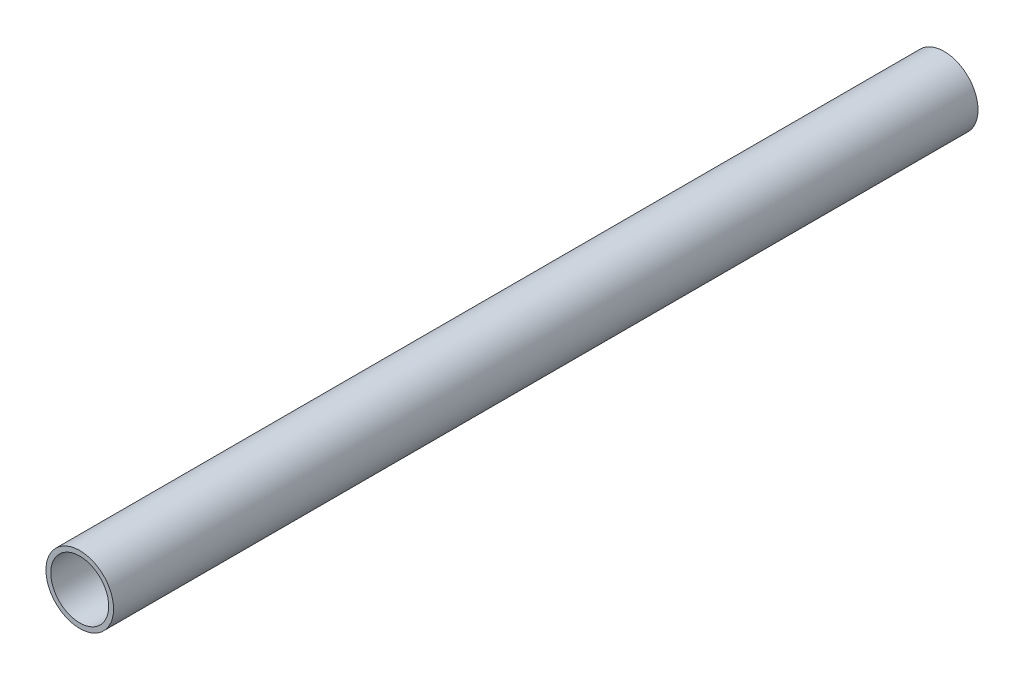
ISO-10303-21;
HEADER;
FILE_DESCRIPTION(('STEP AP214'),'2;1');
FILE_NAME('part.step','',(''),(''),'','','');
FILE_SCHEMA(('AUTOMOTIVE_DESIGN { 1 0 10303 214 1 1 1 1 }'));
ENDSEC;
DATA;
#1=APPLICATION_CONTEXT('core data for automotive mechanical design processes');
#2=APPLICATION_PROTOCOL_DEFINITION('international standard','automotive_design',2000,#1);
#3=PRODUCT_CONTEXT('',#1,'mechanical');
#4=PRODUCT('Part','Part','',(#3));
#5=PRODUCT_RELATED_PRODUCT_CATEGORY('part','',(#4));
#6=PRODUCT_DEFINITION_FORMATION('','',#4);
#7=PRODUCT_DEFINITION_CONTEXT('part definition',#1,'design');
#8=PRODUCT_DEFINITION('design','',#6,#7);
#9=PRODUCT_DEFINITION_SHAPE('','',#8);
#10=(LENGTH_UNIT() NAMED_UNIT(*) SI_UNIT(.MILLI.,.METRE.));
#11=(NAMED_UNIT(*) PLANE_ANGLE_UNIT() SI_UNIT($,.RADIAN.));
#12=(NAMED_UNIT(*) SI_UNIT($,.STERADIAN.) SOLID_ANGLE_UNIT());
#13=UNCERTAINTY_MEASURE_WITH_UNIT(LENGTH_MEASURE(1.E-05),#10,'distance_accuracy_value','');
#14=(GEOMETRIC_REPRESENTATION_CONTEXT(3) GLOBAL_UNCERTAINTY_ASSIGNED_CONTEXT((#13)) GLOBAL_UNIT_ASSIGNED_CONTEXT((#10,
#11,#12)) REPRESENTATION_CONTEXT('',''));
#15=CARTESIAN_POINT('',(0.,0.,0.));
#16=DIRECTION('',(0.,0.,1.));
#17=DIRECTION('',(1.,0.,0.));
#18=AXIS2_PLACEMENT_3D('',#15,#16,#17);
#19=CARTESIAN_POINT('',(0.,0.,142.113));
#20=DIRECTION('',(0.,0.,1.));
#21=DIRECTION('',(1.,0.,0.));
#22=AXIS2_PLACEMENT_3D('',#19,#20,#21);
#23=PLANE('',#22);
#24=CARTESIAN_POINT('',(0.,0.,142.113));
#25=DIRECTION('',(0.,0.,1.));
#26=DIRECTION('',(1.,0.,0.));
#27=AXIS2_PLACEMENT_3D('',#24,#25,#26);
#28=CIRCLE('',#27,11.1125);
#29=CARTESIAN_POINT('',(11.1125,0.,142.113));
#30=VERTEX_POINT('',#29);
#31=EDGE_CURVE('E10',#30,#30,#28,.T.);
#32=ORIENTED_EDGE('',*,*,#31,.T.);
#33=EDGE_LOOP('',(#32));
#34=FACE_BOUND('',#33,.T.);
#35=CARTESIAN_POINT('',(0.,0.,142.113));
#36=DIRECTION('',(0.,0.,1.));
#37=DIRECTION('',(1.,0.,0.));
#38=AXIS2_PLACEMENT_3D('',#35,#36,#37);
#39=CIRCLE('',#38,9.525);
#40=CARTESIAN_POINT('',(9.525,0.,142.113));
#41=VERTEX_POINT('',#40);
#42=EDGE_CURVE('E45',#41,#41,#39,.T.);
#43=ORIENTED_EDGE('',*,*,#42,.F.);
#44=EDGE_LOOP('',(#43));
#45=FACE_BOUND('',#44,.T.);
#46=ADVANCED_FACE('F34',(#34,#45),#23,.T.);
#47=CARTESIAN_POINT('',(0.,0.,-142.113));
#48=DIRECTION('',(0.,0.,1.));
#49=DIRECTION('',(1.,0.,0.));
#50=AXIS2_PLACEMENT_3D('',#47,#48,#49);
#51=PLANE('',#50);
#52=CARTESIAN_POINT('',(0.,0.,-142.113));
#53=DIRECTION('',(0.,0.,1.));
#54=DIRECTION('',(1.,0.,0.));
#55=AXIS2_PLACEMENT_3D('',#52,#53,#54);
#56=CIRCLE('',#55,11.1125);
#57=CARTESIAN_POINT('',(11.1125,0.,-142.113));
#58=VERTEX_POINT('',#57);
#59=EDGE_CURVE('E38',#58,#58,#56,.T.);
#60=ORIENTED_EDGE('',*,*,#59,.F.);
#61=EDGE_LOOP('',(#60));
#62=FACE_BOUND('',#61,.T.);
#63=CARTESIAN_POINT('',(0.,0.,-142.113));
#64=DIRECTION('',(0.,0.,1.));
#65=DIRECTION('',(1.,0.,0.));
#66=AXIS2_PLACEMENT_3D('',#63,#64,#65);
#67=CIRCLE('',#66,9.525);
#68=CARTESIAN_POINT('',(9.525,0.,-142.113));
#69=VERTEX_POINT('',#68);
#70=EDGE_CURVE('E47',#69,#69,#67,.T.);
#71=ORIENTED_EDGE('',*,*,#70,.T.);
#72=EDGE_LOOP('',(#71));
#73=FACE_BOUND('',#72,.T.);
#74=ADVANCED_FACE('F57',(#62,#73),#51,.F.);
#75=CARTESIAN_POINT('',(0.,0.,142.113));
#76=DIRECTION('',(0.,0.,-1.));
#77=DIRECTION('',(-1.,0.,0.));
#78=AXIS2_PLACEMENT_3D('',#75,#76,#77);
#79=CYLINDRICAL_SURFACE('',#78,11.1125);
#80=ORIENTED_EDGE('',*,*,#31,.F.);
#81=EDGE_LOOP('',(#80));
#82=FACE_BOUND('',#81,.T.);
#83=ORIENTED_EDGE('',*,*,#59,.T.);
#84=EDGE_LOOP('',(#83));
#85=FACE_BOUND('',#84,.T.);
#86=ADVANCED_FACE('F36',(#82,#85),#79,.T.);
#87=CARTESIAN_POINT('',(0.,0.,142.113));
#88=DIRECTION('',(0.,0.,-1.));
#89=DIRECTION('',(-1.,0.,0.));
#90=AXIS2_PLACEMENT_3D('',#87,#88,#89);
#91=CYLINDRICAL_SURFACE('',#90,9.525);
#92=ORIENTED_EDGE('',*,*,#42,.T.);
#93=EDGE_LOOP('',(#92));
#94=FACE_BOUND('',#93,.T.);
#95=ORIENTED_EDGE('',*,*,#70,.F.);
#96=EDGE_LOOP('',(#95));
#97=FACE_BOUND('',#96,.T.);
#98=ADVANCED_FACE('F53',(#94,#97),#91,.F.);
#99=CLOSED_SHELL('',(#46,#74,#86,#98));
#100=MANIFOLD_SOLID_BREP('B2',#99);
#101=ADVANCED_BREP_SHAPE_REPRESENTATION('',(#18,#100),#14);
#102=SHAPE_DEFINITION_REPRESENTATION(#9,#101);
ENDSEC;
END-ISO-10303-21;
